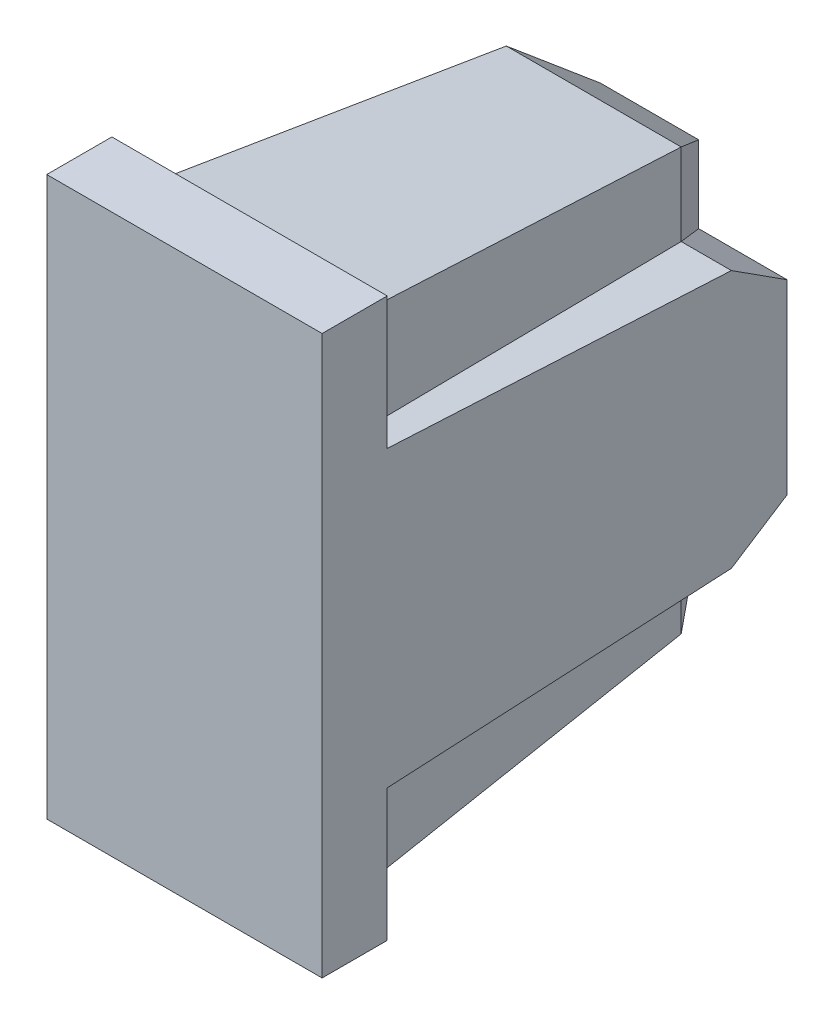
ISO-10303-21;
HEADER;
FILE_DESCRIPTION(('STEP AP214'),'2;1');
FILE_NAME('part.step','',(''),(''),'','','');
FILE_SCHEMA(('AUTOMOTIVE_DESIGN { 1 0 10303 214 1 1 1 1 }'));
ENDSEC;
DATA;
#1=APPLICATION_CONTEXT('core data for automotive mechanical design processes');
#2=APPLICATION_PROTOCOL_DEFINITION('international standard','automotive_design',2000,#1);
#3=PRODUCT_CONTEXT('',#1,'mechanical');
#4=PRODUCT('Part','Part','',(#3));
#5=PRODUCT_RELATED_PRODUCT_CATEGORY('part','',(#4));
#6=PRODUCT_DEFINITION_FORMATION('','',#4);
#7=PRODUCT_DEFINITION_CONTEXT('part definition',#1,'design');
#8=PRODUCT_DEFINITION('design','',#6,#7);
#9=PRODUCT_DEFINITION_SHAPE('','',#8);
#10=(LENGTH_UNIT() NAMED_UNIT(*) SI_UNIT(.MILLI.,.METRE.));
#11=(NAMED_UNIT(*) PLANE_ANGLE_UNIT() SI_UNIT($,.RADIAN.));
#12=(NAMED_UNIT(*) SI_UNIT($,.STERADIAN.) SOLID_ANGLE_UNIT());
#13=UNCERTAINTY_MEASURE_WITH_UNIT(LENGTH_MEASURE(1.E-05),#10,'distance_accuracy_value','');
#14=(GEOMETRIC_REPRESENTATION_CONTEXT(3) GLOBAL_UNCERTAINTY_ASSIGNED_CONTEXT((#13)) GLOBAL_UNIT_ASSIGNED_CONTEXT((#10,
#11,#12)) REPRESENTATION_CONTEXT('',''));
#15=CARTESIAN_POINT('',(0.,0.,0.));
#16=DIRECTION('',(0.,0.,1.));
#17=DIRECTION('',(1.,0.,0.));
#18=AXIS2_PLACEMENT_3D('',#15,#16,#17);
#19=CARTESIAN_POINT('',(4.7,13.4,-22.));
#20=DIRECTION('',(-0.824126188622015,0.,0.566406236924833));
#21=DIRECTION('',(0.566406236924833,0.,0.824126188622015));
#22=AXIS2_PLACEMENT_3D('',#19,#20,#21);
#23=PLANE('',#22);
#24=DIRECTION('',(0.500396351200816,0.468509599618022,0.728081208911939));
#25=VECTOR('',#24,1.);
#26=CARTESIAN_POINT('',(2.63815712419518,5.,-25.));
#27=LINE('',#26,#25);
#28=CARTESIAN_POINT('',(2.63815712419518,5.,-25.));
#29=VERTEX_POINT('',#28);
#30=CARTESIAN_POINT('',(4.7,6.93045608326372,-22.));
#31=VERTEX_POINT('',#30);
#32=EDGE_CURVE('E129',#29,#31,#27,.T.);
#33=ORIENTED_EDGE('',*,*,#32,.F.);
#34=DIRECTION('',(0.,1.,0.));
#35=VECTOR('',#34,1.);
#36=CARTESIAN_POINT('',(2.63815712419518,13.4,-25.));
#37=LINE('',#36,#35);
#38=CARTESIAN_POINT('',(2.63815712419517,9.137,-25.));
#39=VERTEX_POINT('',#38);
#40=EDGE_CURVE('E175',#29,#39,#37,.T.);
#41=ORIENTED_EDGE('',*,*,#40,.T.);
#42=DIRECTION('',(-0.485019803418467,-0.516460779286865,-0.7057081930588));
#43=VECTOR('',#42,1.);
#44=CARTESIAN_POINT('',(4.70000000000003,11.3325,-22.));
#45=LINE('',#44,#43);
#46=CARTESIAN_POINT('',(4.70000000000001,11.3325,-22.));
#47=VERTEX_POINT('',#46);
#48=EDGE_CURVE('E143',#47,#39,#45,.T.);
#49=ORIENTED_EDGE('',*,*,#48,.F.);
#50=DIRECTION('',(0.,1.,0.));
#51=VECTOR('',#50,1.);
#52=CARTESIAN_POINT('',(4.7,13.4,-22.));
#53=LINE('',#52,#51);
#54=EDGE_CURVE('E141',#47,#31,#53,.F.);
#55=ORIENTED_EDGE('',*,*,#54,.T.);
#56=EDGE_LOOP('',(#33,#41,#49,#55));
#57=FACE_BOUND('',#56,.T.);
#58=ADVANCED_FACE('F16',(#57),#23,.F.);
#59=CARTESIAN_POINT('',(-7.4,15.,0.));
#60=DIRECTION('',(0.,0.,-1.));
#61=DIRECTION('',(-1.,0.,0.));
#62=AXIS2_PLACEMENT_3D('',#59,#60,#61);
#63=PLANE('',#62);
#64=DIRECTION('',(0.,1.,0.));
#65=VECTOR('',#64,1.);
#66=CARTESIAN_POINT('',(7.4,15.,0.));
#67=LINE('',#66,#65);
#68=CARTESIAN_POINT('',(7.4,-15.,0.));
#69=VERTEX_POINT('',#68);
#70=CARTESIAN_POINT('',(7.4,15.,0.));
#71=VERTEX_POINT('',#70);
#72=EDGE_CURVE('E191',#69,#71,#67,.T.);
#73=ORIENTED_EDGE('',*,*,#72,.T.);
#74=DIRECTION('',(1.,0.,0.));
#75=VECTOR('',#74,1.);
#76=CARTESIAN_POINT('',(0.,15.,0.));
#77=LINE('',#76,#75);
#78=CARTESIAN_POINT('',(-7.4,15.,0.));
#79=VERTEX_POINT('',#78);
#80=EDGE_CURVE('E156',#79,#71,#77,.T.);
#81=ORIENTED_EDGE('',*,*,#80,.F.);
#82=DIRECTION('',(0.,1.,0.));
#83=VECTOR('',#82,1.);
#84=CARTESIAN_POINT('',(-7.4,15.,0.));
#85=LINE('',#84,#83);
#86=CARTESIAN_POINT('',(-7.4,-15.,0.));
#87=VERTEX_POINT('',#86);
#88=EDGE_CURVE('E183',#79,#87,#85,.F.);
#89=ORIENTED_EDGE('',*,*,#88,.T.);
#90=DIRECTION('',(1.,0.,0.));
#91=VECTOR('',#90,1.);
#92=CARTESIAN_POINT('',(0.,-15.,0.));
#93=LINE('',#92,#91);
#94=EDGE_CURVE('E188',#87,#69,#93,.T.);
#95=ORIENTED_EDGE('',*,*,#94,.T.);
#96=EDGE_LOOP('',(#73,#81,#89,#95));
#97=FACE_BOUND('',#96,.T.);
#98=ADVANCED_FACE('F353',(#97),#63,.F.);
#99=CARTESIAN_POINT('',(1.5,6.93045608326374,-22.));
#100=DIRECTION('',(0.,0.998629534754574,-0.0523359562429439));
#101=DIRECTION('',(0.,0.0523359562429439,0.998629534754574));
#102=AXIS2_PLACEMENT_3D('',#99,#100,#101);
#103=PLANE('',#102);
#104=DIRECTION('',(0.,-0.0523359562429437,-0.998629534754574));
#105=VECTOR('',#104,1.);
#106=CARTESIAN_POINT('',(7.4,7.9,-3.5));
#107=LINE('',#106,#105);
#108=CARTESIAN_POINT('',(7.4,7.9,-3.5));
#109=VERTEX_POINT('',#108);
#110=CARTESIAN_POINT('',(7.4,6.93045608326374,-22.));
#111=VERTEX_POINT('',#110);
#112=EDGE_CURVE('E161',#109,#111,#107,.T.);
#113=ORIENTED_EDGE('',*,*,#112,.T.);
#114=DIRECTION('',(1.,0.,0.));
#115=VECTOR('',#114,1.);
#116=CARTESIAN_POINT('',(1.5,6.93045608326373,-22.));
#117=LINE('',#116,#115);
#118=EDGE_CURVE('E134',#31,#111,#117,.T.);
#119=ORIENTED_EDGE('',*,*,#118,.F.);
#120=DIRECTION('',(0.0646404983976404,0.0522265016635286,0.996541016963624));
#121=VECTOR('',#120,1.);
#122=CARTESIAN_POINT('',(4.7,6.93045608326371,-22.));
#123=LINE('',#122,#121);
#124=CARTESIAN_POINT('',(5.9,7.9,-3.5));
#125=VERTEX_POINT('',#124);
#126=EDGE_CURVE('E147',#31,#125,#123,.T.);
#127=ORIENTED_EDGE('',*,*,#126,.T.);
#128=DIRECTION('',(1.,0.,0.));
#129=VECTOR('',#128,1.);
#130=CARTESIAN_POINT('',(1.5,7.9,-3.5));
#131=LINE('',#130,#129);
#132=EDGE_CURVE('E19',#125,#109,#131,.T.);
#133=ORIENTED_EDGE('',*,*,#132,.T.);
#134=EDGE_LOOP('',(#113,#119,#127,#133));
#135=FACE_BOUND('',#134,.T.);
#136=ADVANCED_FACE('F159',(#135),#103,.T.);
#137=CARTESIAN_POINT('',(1.5,5.,-25.));
#138=DIRECTION('',(0.,0.840938085920306,-0.541131347871006));
#139=DIRECTION('',(0.,0.541131347871006,0.840938085920306));
#140=AXIS2_PLACEMENT_3D('',#137,#138,#139);
#141=PLANE('',#140);
#142=DIRECTION('',(0.,-0.541131347871006,-0.840938085920306));
#143=VECTOR('',#142,1.);
#144=CARTESIAN_POINT('',(7.4,6.93045608326374,-22.));
#145=LINE('',#144,#143);
#146=CARTESIAN_POINT('',(7.4,5.,-25.));
#147=VERTEX_POINT('',#146);
#148=EDGE_CURVE('E197',#111,#147,#145,.T.);
#149=ORIENTED_EDGE('',*,*,#148,.T.);
#150=DIRECTION('',(1.,0.,0.));
#151=VECTOR('',#150,1.);
#152=CARTESIAN_POINT('',(2.63815712419518,5.,-25.));
#153=LINE('',#152,#151);
#154=EDGE_CURVE('E136',#147,#29,#153,.F.);
#155=ORIENTED_EDGE('',*,*,#154,.T.);
#156=ORIENTED_EDGE('',*,*,#32,.T.);
#157=ORIENTED_EDGE('',*,*,#118,.T.);
#158=EDGE_LOOP('',(#149,#155,#156,#157));
#159=FACE_BOUND('',#158,.T.);
#160=ADVANCED_FACE('F132',(#159),#141,.T.);
#161=CARTESIAN_POINT('',(1.5,-6.93045608326374,-22.));
#162=DIRECTION('',(0.,-0.840938085920306,-0.541131347871006));
#163=DIRECTION('',(0.,0.541131347871006,-0.840938085920306));
#164=AXIS2_PLACEMENT_3D('',#161,#162,#163);
#165=PLANE('',#164);
#166=DIRECTION('',(0.,-0.541131347871006,0.840938085920306));
#167=VECTOR('',#166,1.);
#168=CARTESIAN_POINT('',(7.4,-5.,-25.));
#169=LINE('',#168,#167);
#170=CARTESIAN_POINT('',(7.4,-5.,-25.));
#171=VERTEX_POINT('',#170);
#172=CARTESIAN_POINT('',(7.4,-6.93045608326374,-22.));
#173=VERTEX_POINT('',#172);
#174=EDGE_CURVE('E202',#171,#173,#169,.T.);
#175=ORIENTED_EDGE('',*,*,#174,.T.);
#176=DIRECTION('',(1.,0.,0.));
#177=VECTOR('',#176,1.);
#178=CARTESIAN_POINT('',(1.5,-6.93045608326374,-22.));
#179=LINE('',#178,#177);
#180=CARTESIAN_POINT('',(4.70000000000001,-6.93045608326373,-22.));
#181=VERTEX_POINT('',#180);
#182=EDGE_CURVE('E162',#181,#173,#179,.T.);
#183=ORIENTED_EDGE('',*,*,#182,.F.);
#184=DIRECTION('',(-0.500396351200819,0.468509599618019,-0.728081208911939));
#185=VECTOR('',#184,1.);
#186=CARTESIAN_POINT('',(4.7,-6.93045608326372,-22.));
#187=LINE('',#186,#185);
#188=CARTESIAN_POINT('',(2.63815712419517,-5.,-25.));
#189=VERTEX_POINT('',#188);
#190=EDGE_CURVE('E124',#181,#189,#187,.T.);
#191=ORIENTED_EDGE('',*,*,#190,.T.);
#192=DIRECTION('',(1.,0.,0.));
#193=VECTOR('',#192,1.);
#194=CARTESIAN_POINT('',(2.63815712419518,-5.,-25.));
#195=LINE('',#194,#193);
#196=EDGE_CURVE('E172',#189,#171,#195,.T.);
#197=ORIENTED_EDGE('',*,*,#196,.T.);
#198=EDGE_LOOP('',(#175,#183,#191,#197));
#199=FACE_BOUND('',#198,.T.);
#200=ADVANCED_FACE('F346',(#199),#165,.T.);
#201=CARTESIAN_POINT('',(1.5,-7.9,-3.5));
#202=DIRECTION('',(0.,-0.998629534754574,-0.0523359562429439));
#203=DIRECTION('',(0.,0.0523359562429439,-0.998629534754574));
#204=AXIS2_PLACEMENT_3D('',#201,#202,#203);
#205=PLANE('',#204);
#206=DIRECTION('',(0.,-0.0523359562429437,0.998629534754574));
#207=VECTOR('',#206,1.);
#208=CARTESIAN_POINT('',(7.4,-6.93045608326374,-22.));
#209=LINE('',#208,#207);
#210=CARTESIAN_POINT('',(7.4,-7.9,-3.5));
#211=VERTEX_POINT('',#210);
#212=EDGE_CURVE('E205',#173,#211,#209,.T.);
#213=ORIENTED_EDGE('',*,*,#212,.T.);
#214=DIRECTION('',(1.,0.,0.));
#215=VECTOR('',#214,1.);
#216=CARTESIAN_POINT('',(1.5,-7.9,-3.5));
#217=LINE('',#216,#215);
#218=CARTESIAN_POINT('',(5.9,-7.9,-3.5));
#219=VERTEX_POINT('',#218);
#220=EDGE_CURVE('E164',#211,#219,#217,.F.);
#221=ORIENTED_EDGE('',*,*,#220,.T.);
#222=DIRECTION('',(-0.0646404983976404,0.052226501663528,-0.996541016963624));
#223=VECTOR('',#222,1.);
#224=CARTESIAN_POINT('',(5.9,-7.9,-3.5));
#225=LINE('',#224,#223);
#226=EDGE_CURVE('E216',#219,#181,#225,.T.);
#227=ORIENTED_EDGE('',*,*,#226,.T.);
#228=ORIENTED_EDGE('',*,*,#182,.T.);
#229=EDGE_LOOP('',(#213,#221,#227,#228));
#230=FACE_BOUND('',#229,.T.);
#231=ADVANCED_FACE('F343',(#230),#205,.T.);
#232=CARTESIAN_POINT('',(4.7,13.4,-22.));
#233=DIRECTION('',(-0.824126188622015,0.,0.566406236924833));
#234=DIRECTION('',(0.566406236924833,0.,0.824126188622015));
#235=AXIS2_PLACEMENT_3D('',#232,#233,#234);
#236=PLANE('',#235);
#237=ORIENTED_EDGE('',*,*,#190,.F.);
#238=DIRECTION('',(0.,1.,0.));
#239=VECTOR('',#238,1.);
#240=CARTESIAN_POINT('',(4.7,13.4,-22.));
#241=LINE('',#240,#239);
#242=CARTESIAN_POINT('',(4.70000000000002,-11.3325,-22.));
#243=VERTEX_POINT('',#242);
#244=EDGE_CURVE('E219',#181,#243,#241,.F.);
#245=ORIENTED_EDGE('',*,*,#244,.T.);
#246=DIRECTION('',(0.485019803418467,-0.516460779286864,0.7057081930588));
#247=VECTOR('',#246,1.);
#248=CARTESIAN_POINT('',(2.63815712419518,-9.137,-25.));
#249=LINE('',#248,#247);
#250=CARTESIAN_POINT('',(2.63815712419517,-9.137,-25.));
#251=VERTEX_POINT('',#250);
#252=EDGE_CURVE('E211',#251,#243,#249,.T.);
#253=ORIENTED_EDGE('',*,*,#252,.F.);
#254=DIRECTION('',(0.,1.,0.));
#255=VECTOR('',#254,1.);
#256=CARTESIAN_POINT('',(2.63815712419518,13.4,-25.));
#257=LINE('',#256,#255);
#258=EDGE_CURVE('E169',#251,#189,#257,.T.);
#259=ORIENTED_EDGE('',*,*,#258,.T.);
#260=EDGE_LOOP('',(#237,#245,#253,#259));
#261=FACE_BOUND('',#260,.T.);
#262=ADVANCED_FACE('F294',(#261),#236,.F.);
#263=CARTESIAN_POINT('',(2.63815712419518,13.4,-25.));
#264=DIRECTION('',(0.,0.,1.));
#265=DIRECTION('',(1.,0.,0.));
#266=AXIS2_PLACEMENT_3D('',#263,#264,#265);
#267=PLANE('',#266);
#268=ORIENTED_EDGE('',*,*,#154,.F.);
#269=DIRECTION('',(0.,1.,0.));
#270=VECTOR('',#269,1.);
#271=CARTESIAN_POINT('',(7.4,15.,-25.));
#272=LINE('',#271,#270);
#273=EDGE_CURVE('E199',#147,#171,#272,.F.);
#274=ORIENTED_EDGE('',*,*,#273,.T.);
#275=ORIENTED_EDGE('',*,*,#196,.F.);
#276=ORIENTED_EDGE('',*,*,#258,.F.);
#277=DIRECTION('',(1.,0.,0.));
#278=VECTOR('',#277,1.);
#279=CARTESIAN_POINT('',(5.9,-9.137,-25.));
#280=LINE('',#279,#278);
#281=CARTESIAN_POINT('',(-2.63815712419518,-9.137,-25.));
#282=VERTEX_POINT('',#281);
#283=EDGE_CURVE('E213',#282,#251,#280,.T.);
#284=ORIENTED_EDGE('',*,*,#283,.F.);
#285=DIRECTION('',(0.,1.,0.));
#286=VECTOR('',#285,1.);
#287=CARTESIAN_POINT('',(-2.63815712419518,13.4,-25.));
#288=LINE('',#287,#286);
#289=CARTESIAN_POINT('',(-2.63815712419518,9.137,-25.));
#290=VERTEX_POINT('',#289);
#291=EDGE_CURVE('E225',#282,#290,#288,.T.);
#292=ORIENTED_EDGE('',*,*,#291,.T.);
#293=DIRECTION('',(1.,0.,0.));
#294=VECTOR('',#293,1.);
#295=CARTESIAN_POINT('',(5.9,9.137,-25.));
#296=LINE('',#295,#294);
#297=EDGE_CURVE('E148',#39,#290,#296,.F.);
#298=ORIENTED_EDGE('',*,*,#297,.F.);
#299=ORIENTED_EDGE('',*,*,#40,.F.);
#300=EDGE_LOOP('',(#268,#274,#275,#276,#284,#292,#298,#299));
#301=FACE_BOUND('',#300,.T.);
#302=ADVANCED_FACE('F288',(#301),#267,.F.);
#303=CARTESIAN_POINT('',(5.9,11.3325,-22.));
#304=DIRECTION('',(0.,0.80698186025625,-0.590576224730865));
#305=DIRECTION('',(0.,0.590576224730865,0.80698186025625));
#306=AXIS2_PLACEMENT_3D('',#303,#304,#305);
#307=PLANE('',#306);
#308=DIRECTION('',(-0.485019803418465,0.516460779286865,0.705708193058801));
#309=VECTOR('',#308,1.);
#310=CARTESIAN_POINT('',(-2.63815712419518,9.137,-25.));
#311=LINE('',#310,#309);
#312=CARTESIAN_POINT('',(-4.70000000000003,11.3325,-22.));
#313=VERTEX_POINT('',#312);
#314=EDGE_CURVE('E228',#290,#313,#311,.T.);
#315=ORIENTED_EDGE('',*,*,#314,.T.);
#316=DIRECTION('',(1.,0.,0.));
#317=VECTOR('',#316,1.);
#318=CARTESIAN_POINT('',(5.9,11.3325,-22.));
#319=LINE('',#318,#317);
#320=EDGE_CURVE('E233',#47,#313,#319,.F.);
#321=ORIENTED_EDGE('',*,*,#320,.F.);
#322=ORIENTED_EDGE('',*,*,#48,.T.);
#323=ORIENTED_EDGE('',*,*,#297,.T.);
#324=EDGE_LOOP('',(#315,#321,#322,#323));
#325=FACE_BOUND('',#324,.T.);
#326=ADVANCED_FACE('F282',(#325),#307,.T.);
#327=CARTESIAN_POINT('',(5.9,13.4,-3.5));
#328=DIRECTION('',(-0.997902889952968,0.,0.0647288361050573));
#329=DIRECTION('',(0.0647288361050573,0.,0.997902889952968));
#330=AXIS2_PLACEMENT_3D('',#327,#328,#329);
#331=PLANE('',#330);
#332=ORIENTED_EDGE('',*,*,#126,.F.);
#333=ORIENTED_EDGE('',*,*,#54,.F.);
#334=DIRECTION('',(-0.0643300281757488,-0.110835277711137,-0.99175460104282));
#335=VECTOR('',#334,1.);
#336=CARTESIAN_POINT('',(5.9,13.4,-3.5));
#337=LINE('',#336,#335);
#338=CARTESIAN_POINT('',(5.9,13.4,-3.5));
#339=VERTEX_POINT('',#338);
#340=EDGE_CURVE('E231',#339,#47,#337,.T.);
#341=ORIENTED_EDGE('',*,*,#340,.F.);
#342=DIRECTION('',(0.,1.,0.));
#343=VECTOR('',#342,1.);
#344=CARTESIAN_POINT('',(5.9,15.,-3.5));
#345=LINE('',#344,#343);
#346=EDGE_CURVE('E154',#339,#125,#345,.F.);
#347=ORIENTED_EDGE('',*,*,#346,.T.);
#348=EDGE_LOOP('',(#332,#333,#341,#347));
#349=FACE_BOUND('',#348,.T.);
#350=ADVANCED_FACE('F152',(#349),#331,.F.);
#351=CARTESIAN_POINT('',(0.,15.,0.));
#352=DIRECTION('',(0.,1.,0.));
#353=DIRECTION('',(0.,0.,1.));
#354=AXIS2_PLACEMENT_3D('',#351,#352,#353);
#355=PLANE('',#354);
#356=ORIENTED_EDGE('',*,*,#80,.T.);
#357=DIRECTION('',(0.,0.,1.));
#358=VECTOR('',#357,1.);
#359=CARTESIAN_POINT('',(7.4,15.,0.));
#360=LINE('',#359,#358);
#361=CARTESIAN_POINT('',(7.4,15.,-3.5));
#362=VERTEX_POINT('',#361);
#363=EDGE_CURVE('E194',#71,#362,#360,.F.);
#364=ORIENTED_EDGE('',*,*,#363,.T.);
#365=DIRECTION('',(1.,0.,0.));
#366=VECTOR('',#365,1.);
#367=CARTESIAN_POINT('',(7.4,15.,-3.5));
#368=LINE('',#367,#366);
#369=CARTESIAN_POINT('',(-7.4,15.,-3.5));
#370=VERTEX_POINT('',#369);
#371=EDGE_CURVE('E242',#362,#370,#368,.F.);
#372=ORIENTED_EDGE('',*,*,#371,.T.);
#373=DIRECTION('',(0.,0.,-1.));
#374=VECTOR('',#373,1.);
#375=CARTESIAN_POINT('',(-7.4,15.,-3.5));
#376=LINE('',#375,#374);
#377=EDGE_CURVE('E180',#370,#79,#376,.F.);
#378=ORIENTED_EDGE('',*,*,#377,.T.);
#379=EDGE_LOOP('',(#356,#364,#372,#378));
#380=FACE_BOUND('',#379,.T.);
#381=ADVANCED_FACE('F330',(#380),#355,.T.);
#382=CARTESIAN_POINT('',(-7.4,15.,-3.5));
#383=DIRECTION('',(1.,0.,0.));
#384=DIRECTION('',(0.,0.,-1.));
#385=AXIS2_PLACEMENT_3D('',#382,#383,#384);
#386=PLANE('',#385);
#387=ORIENTED_EDGE('',*,*,#88,.F.);
#388=ORIENTED_EDGE('',*,*,#377,.F.);
#389=DIRECTION('',(0.,1.,0.));
#390=VECTOR('',#389,1.);
#391=CARTESIAN_POINT('',(-7.4,15.,-3.5));
#392=LINE('',#391,#390);
#393=CARTESIAN_POINT('',(-7.4,-15.,-3.5));
#394=VERTEX_POINT('',#393);
#395=EDGE_CURVE('E245',#370,#394,#392,.F.);
#396=ORIENTED_EDGE('',*,*,#395,.T.);
#397=DIRECTION('',(0.,0.,1.));
#398=VECTOR('',#397,1.);
#399=CARTESIAN_POINT('',(-7.4,-15.,0.));
#400=LINE('',#399,#398);
#401=EDGE_CURVE('E185',#394,#87,#400,.T.);
#402=ORIENTED_EDGE('',*,*,#401,.T.);
#403=EDGE_LOOP('',(#387,#388,#396,#402));
#404=FACE_BOUND('',#403,.T.);
#405=ADVANCED_FACE('F326',(#404),#386,.F.);
#406=CARTESIAN_POINT('',(0.,-15.,0.));
#407=DIRECTION('',(0.,1.,0.));
#408=DIRECTION('',(0.,0.,1.));
#409=AXIS2_PLACEMENT_3D('',#406,#407,#408);
#410=PLANE('',#409);
#411=DIRECTION('',(0.,0.,1.));
#412=VECTOR('',#411,1.);
#413=CARTESIAN_POINT('',(7.4,-15.,0.));
#414=LINE('',#413,#412);
#415=CARTESIAN_POINT('',(7.4,-15.,-3.5));
#416=VERTEX_POINT('',#415);
#417=EDGE_CURVE('E208',#416,#69,#414,.T.);
#418=ORIENTED_EDGE('',*,*,#417,.T.);
#419=ORIENTED_EDGE('',*,*,#94,.F.);
#420=ORIENTED_EDGE('',*,*,#401,.F.);
#421=DIRECTION('',(1.,0.,0.));
#422=VECTOR('',#421,1.);
#423=CARTESIAN_POINT('',(7.4,-15.,-3.5));
#424=LINE('',#423,#422);
#425=EDGE_CURVE('E248',#394,#416,#424,.T.);
#426=ORIENTED_EDGE('',*,*,#425,.T.);
#427=EDGE_LOOP('',(#418,#419,#420,#426));
#428=FACE_BOUND('',#427,.T.);
#429=ADVANCED_FACE('F322',(#428),#410,.F.);
#430=CARTESIAN_POINT('',(7.4,15.,0.));
#431=DIRECTION('',(-1.,0.,0.));
#432=DIRECTION('',(0.,0.,1.));
#433=AXIS2_PLACEMENT_3D('',#430,#431,#432);
#434=PLANE('',#433);
#435=DIRECTION('',(0.,1.,0.));
#436=VECTOR('',#435,1.);
#437=CARTESIAN_POINT('',(7.4,15.,-3.5));
#438=LINE('',#437,#436);
#439=EDGE_CURVE('E251',#416,#211,#438,.T.);
#440=ORIENTED_EDGE('',*,*,#439,.T.);
#441=ORIENTED_EDGE('',*,*,#212,.F.);
#442=ORIENTED_EDGE('',*,*,#174,.F.);
#443=ORIENTED_EDGE('',*,*,#273,.F.);
#444=ORIENTED_EDGE('',*,*,#148,.F.);
#445=ORIENTED_EDGE('',*,*,#112,.F.);
#446=DIRECTION('',(0.,1.,0.));
#447=VECTOR('',#446,1.);
#448=CARTESIAN_POINT('',(7.4,15.,-3.5));
#449=LINE('',#448,#447);
#450=EDGE_CURVE('E239',#109,#362,#449,.T.);
#451=ORIENTED_EDGE('',*,*,#450,.T.);
#452=ORIENTED_EDGE('',*,*,#363,.F.);
#453=ORIENTED_EDGE('',*,*,#72,.F.);
#454=ORIENTED_EDGE('',*,*,#417,.F.);
#455=EDGE_LOOP('',(#440,#441,#442,#443,#444,#445,#451,#452,#453,#454));
#456=FACE_BOUND('',#455,.T.);
#457=ADVANCED_FACE('F319',(#456),#434,.F.);
#458=CARTESIAN_POINT('',(5.9,-9.137,-25.));
#459=DIRECTION('',(0.,-0.806981860256251,-0.590576224730865));
#460=DIRECTION('',(0.,0.590576224730865,-0.806981860256251));
#461=AXIS2_PLACEMENT_3D('',#458,#459,#460);
#462=PLANE('',#461);
#463=DIRECTION('',(0.485019803418465,0.516460779286865,-0.705708193058801));
#464=VECTOR('',#463,1.);
#465=CARTESIAN_POINT('',(-4.70000000000003,-11.3325,-22.));
#466=LINE('',#465,#464);
#467=CARTESIAN_POINT('',(-4.70000000000003,-11.3325,-22.));
#468=VERTEX_POINT('',#467);
#469=EDGE_CURVE('E222',#468,#282,#466,.T.);
#470=ORIENTED_EDGE('',*,*,#469,.T.);
#471=ORIENTED_EDGE('',*,*,#283,.T.);
#472=ORIENTED_EDGE('',*,*,#252,.T.);
#473=DIRECTION('',(1.,0.,0.));
#474=VECTOR('',#473,1.);
#475=CARTESIAN_POINT('',(5.9,-11.3325,-22.));
#476=LINE('',#475,#474);
#477=EDGE_CURVE('E257',#468,#243,#476,.T.);
#478=ORIENTED_EDGE('',*,*,#477,.F.);
#479=EDGE_LOOP('',(#470,#471,#472,#478));
#480=FACE_BOUND('',#479,.T.);
#481=ADVANCED_FACE('F291',(#480),#462,.T.);
#482=CARTESIAN_POINT('',(5.9,13.4,-3.5));
#483=DIRECTION('',(-0.997902889952968,0.,0.0647288361050573));
#484=DIRECTION('',(0.0647288361050573,0.,0.997902889952968));
#485=AXIS2_PLACEMENT_3D('',#482,#483,#484);
#486=PLANE('',#485);
#487=ORIENTED_EDGE('',*,*,#226,.F.);
#488=DIRECTION('',(0.,1.,0.));
#489=VECTOR('',#488,1.);
#490=CARTESIAN_POINT('',(5.9,15.,-3.5));
#491=LINE('',#490,#489);
#492=CARTESIAN_POINT('',(5.9,-13.4,-3.5));
#493=VERTEX_POINT('',#492);
#494=EDGE_CURVE('E254',#219,#493,#491,.F.);
#495=ORIENTED_EDGE('',*,*,#494,.T.);
#496=DIRECTION('',(0.0643300281757488,-0.110835277711137,0.99175460104282));
#497=VECTOR('',#496,1.);
#498=CARTESIAN_POINT('',(4.70000000000003,-11.3325,-22.));
#499=LINE('',#498,#497);
#500=EDGE_CURVE('E260',#243,#493,#499,.T.);
#501=ORIENTED_EDGE('',*,*,#500,.F.);
#502=ORIENTED_EDGE('',*,*,#244,.F.);
#503=EDGE_LOOP('',(#487,#495,#501,#502));
#504=FACE_BOUND('',#503,.T.);
#505=ADVANCED_FACE('F299',(#504),#486,.F.);
#506=CARTESIAN_POINT('',(-2.63815712419518,13.4,-25.));
#507=DIRECTION('',(0.824126188622015,0.,0.566406236924833));
#508=DIRECTION('',(0.566406236924833,0.,-0.824126188622015));
#509=AXIS2_PLACEMENT_3D('',#506,#507,#508);
#510=PLANE('',#509);
#511=ORIENTED_EDGE('',*,*,#291,.F.);
#512=ORIENTED_EDGE('',*,*,#469,.F.);
#513=DIRECTION('',(0.,1.,0.));
#514=VECTOR('',#513,1.);
#515=CARTESIAN_POINT('',(-4.7,13.4,-22.));
#516=LINE('',#515,#514);
#517=EDGE_CURVE('E263',#468,#313,#516,.T.);
#518=ORIENTED_EDGE('',*,*,#517,.T.);
#519=ORIENTED_EDGE('',*,*,#314,.F.);
#520=EDGE_LOOP('',(#511,#512,#518,#519));
#521=FACE_BOUND('',#520,.T.);
#522=ADVANCED_FACE('F286',(#521),#510,.F.);
#523=CARTESIAN_POINT('',(5.9,13.4,-3.5));
#524=DIRECTION('',(0.,0.993813107448395,-0.111065329710787));
#525=DIRECTION('',(0.,0.111065329710787,0.993813107448395));
#526=AXIS2_PLACEMENT_3D('',#523,#524,#525);
#527=PLANE('',#526);
#528=ORIENTED_EDGE('',*,*,#340,.T.);
#529=ORIENTED_EDGE('',*,*,#320,.T.);
#530=DIRECTION('',(-0.0643300281757504,0.110835277711137,0.99175460104282));
#531=VECTOR('',#530,1.);
#532=CARTESIAN_POINT('',(-4.7,11.3325,-22.));
#533=LINE('',#532,#531);
#534=CARTESIAN_POINT('',(-5.9,13.4,-3.5));
#535=VERTEX_POINT('',#534);
#536=EDGE_CURVE('E266',#313,#535,#533,.T.);
#537=ORIENTED_EDGE('',*,*,#536,.T.);
#538=DIRECTION('',(1.,0.,0.));
#539=VECTOR('',#538,1.);
#540=CARTESIAN_POINT('',(7.4,13.4,-3.5));
#541=LINE('',#540,#539);
#542=EDGE_CURVE('E235',#535,#339,#541,.T.);
#543=ORIENTED_EDGE('',*,*,#542,.T.);
#544=EDGE_LOOP('',(#528,#529,#537,#543));
#545=FACE_BOUND('',#544,.T.);
#546=ADVANCED_FACE('F279',(#545),#527,.T.);
#547=CARTESIAN_POINT('',(7.4,15.,-3.5));
#548=DIRECTION('',(0.,0.,1.));
#549=DIRECTION('',(1.,0.,0.));
#550=AXIS2_PLACEMENT_3D('',#547,#548,#549);
#551=PLANE('',#550);
#552=ORIENTED_EDGE('',*,*,#220,.F.);
#553=ORIENTED_EDGE('',*,*,#439,.F.);
#554=ORIENTED_EDGE('',*,*,#425,.F.);
#555=ORIENTED_EDGE('',*,*,#395,.F.);
#556=ORIENTED_EDGE('',*,*,#371,.F.);
#557=ORIENTED_EDGE('',*,*,#450,.F.);
#558=ORIENTED_EDGE('',*,*,#132,.F.);
#559=ORIENTED_EDGE('',*,*,#346,.F.);
#560=ORIENTED_EDGE('',*,*,#542,.F.);
#561=DIRECTION('',(0.,1.,0.));
#562=VECTOR('',#561,1.);
#563=CARTESIAN_POINT('',(-5.9,13.4,-3.5));
#564=LINE('',#563,#562);
#565=CARTESIAN_POINT('',(-5.9,-13.4,-3.5));
#566=VERTEX_POINT('',#565);
#567=EDGE_CURVE('E25',#535,#566,#564,.F.);
#568=ORIENTED_EDGE('',*,*,#567,.T.);
#569=DIRECTION('',(1.,0.,0.));
#570=VECTOR('',#569,1.);
#571=CARTESIAN_POINT('',(5.9,-13.4,-3.49999999999999));
#572=LINE('',#571,#570);
#573=EDGE_CURVE('E33',#493,#566,#572,.F.);
#574=ORIENTED_EDGE('',*,*,#573,.F.);
#575=ORIENTED_EDGE('',*,*,#494,.F.);
#576=EDGE_LOOP('',(#552,#553,#554,#555,#556,#557,#558,#559,#560,#568,#574,#575));
#577=FACE_BOUND('',#576,.T.);
#578=ADVANCED_FACE('F272',(#577),#551,.F.);
#579=CARTESIAN_POINT('',(5.9,-11.3325,-22.));
#580=DIRECTION('',(0.,-0.993813107448395,-0.111065329710787));
#581=DIRECTION('',(0.,0.111065329710787,-0.993813107448395));
#582=AXIS2_PLACEMENT_3D('',#579,#580,#581);
#583=PLANE('',#582);
#584=ORIENTED_EDGE('',*,*,#500,.T.);
#585=ORIENTED_EDGE('',*,*,#573,.T.);
#586=DIRECTION('',(0.0643300281757504,0.110835277711137,-0.99175460104282));
#587=VECTOR('',#586,1.);
#588=CARTESIAN_POINT('',(-5.9,-13.4,-3.5));
#589=LINE('',#588,#587);
#590=EDGE_CURVE('E11',#566,#468,#589,.T.);
#591=ORIENTED_EDGE('',*,*,#590,.T.);
#592=ORIENTED_EDGE('',*,*,#477,.T.);
#593=EDGE_LOOP('',(#584,#585,#591,#592));
#594=FACE_BOUND('',#593,.T.);
#595=ADVANCED_FACE('F300',(#594),#583,.T.);
#596=CARTESIAN_POINT('',(-4.7,13.4,-22.));
#597=DIRECTION('',(0.997902889952968,0.,0.0647288361050573));
#598=DIRECTION('',(0.0647288361050573,0.,-0.997902889952968));
#599=AXIS2_PLACEMENT_3D('',#596,#597,#598);
#600=PLANE('',#599);
#601=ORIENTED_EDGE('',*,*,#567,.F.);
#602=ORIENTED_EDGE('',*,*,#536,.F.);
#603=ORIENTED_EDGE('',*,*,#517,.F.);
#604=ORIENTED_EDGE('',*,*,#590,.F.);
#605=EDGE_LOOP('',(#601,#602,#603,#604));
#606=FACE_BOUND('',#605,.T.);
#607=ADVANCED_FACE('F276',(#606),#600,.F.);
#608=CLOSED_SHELL('',(#58,#98,#136,#160,#200,#231,#262,#302,#326,#350,#381,#405,#429,#457,#481,
#505,#522,#546,#578,#595,#607));
#609=MANIFOLD_SOLID_BREP('B1',#608);
#610=ADVANCED_BREP_SHAPE_REPRESENTATION('',(#18,#609),#14);
#611=SHAPE_DEFINITION_REPRESENTATION(#9,#610);
ENDSEC;
END-ISO-10303-21;
